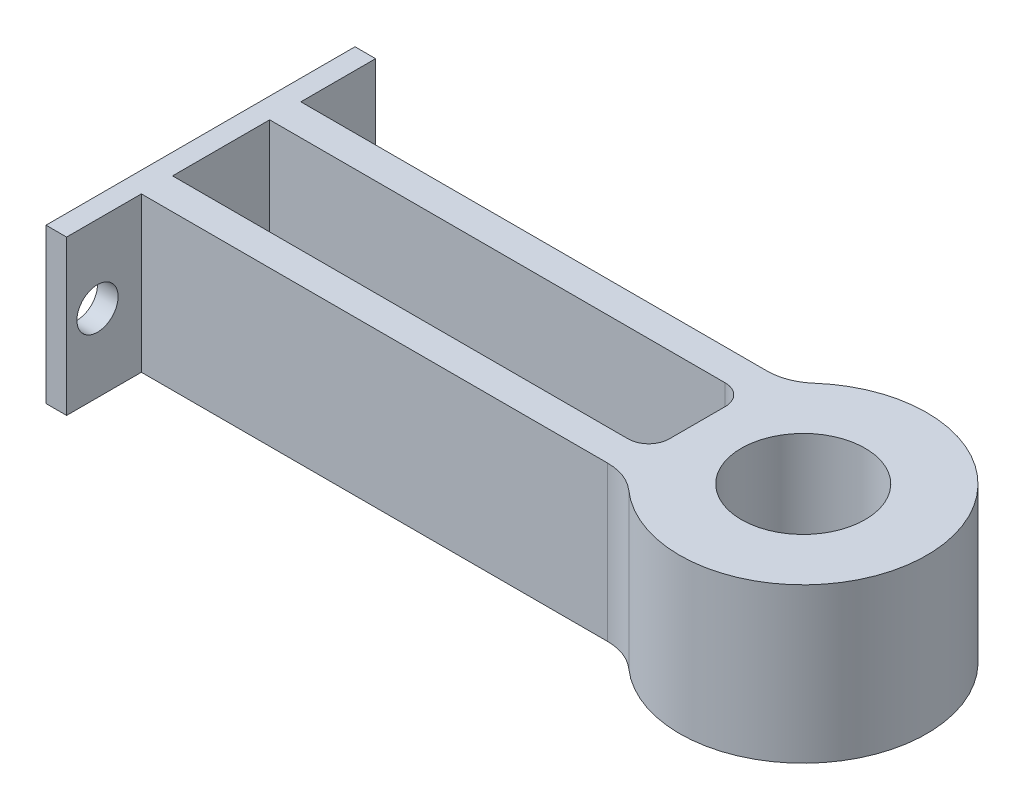
ISO-10303-21;
HEADER;
FILE_DESCRIPTION(('STEP AP214'),'2;1');
FILE_NAME('part.step','',(''),(''),'','','');
FILE_SCHEMA(('AUTOMOTIVE_DESIGN { 1 0 10303 214 1 1 1 1 }'));
ENDSEC;
DATA;
#1=APPLICATION_CONTEXT('core data for automotive mechanical design processes');
#2=APPLICATION_PROTOCOL_DEFINITION('international standard','automotive_design',2000,#1);
#3=PRODUCT_CONTEXT('',#1,'mechanical');
#4=PRODUCT('Part','Part','',(#3));
#5=PRODUCT_RELATED_PRODUCT_CATEGORY('part','',(#4));
#6=PRODUCT_DEFINITION_FORMATION('','',#4);
#7=PRODUCT_DEFINITION_CONTEXT('part definition',#1,'design');
#8=PRODUCT_DEFINITION('design','',#6,#7);
#9=PRODUCT_DEFINITION_SHAPE('','',#8);
#10=(LENGTH_UNIT() NAMED_UNIT(*) SI_UNIT(.MILLI.,.METRE.));
#11=(NAMED_UNIT(*) PLANE_ANGLE_UNIT() SI_UNIT($,.RADIAN.));
#12=(NAMED_UNIT(*) SI_UNIT($,.STERADIAN.) SOLID_ANGLE_UNIT());
#13=UNCERTAINTY_MEASURE_WITH_UNIT(LENGTH_MEASURE(1.E-05),#10,'distance_accuracy_value','');
#14=(GEOMETRIC_REPRESENTATION_CONTEXT(3) GLOBAL_UNCERTAINTY_ASSIGNED_CONTEXT((#13)) GLOBAL_UNIT_ASSIGNED_CONTEXT((#10,
#11,#12)) REPRESENTATION_CONTEXT('',''));
#15=CARTESIAN_POINT('',(0.,0.,0.));
#16=DIRECTION('',(0.,0.,1.));
#17=DIRECTION('',(1.,0.,0.));
#18=AXIS2_PLACEMENT_3D('',#15,#16,#17);
#19=CARTESIAN_POINT('',(-10.2880610801185,15.,6.17703806138108));
#20=DIRECTION('',(-1.,0.,0.));
#21=DIRECTION('',(0.,0.,1.));
#22=AXIS2_PLACEMENT_3D('',#19,#20,#21);
#23=PLANE('',#22);
#24=DIRECTION('',(0.,0.,-1.));
#25=VECTOR('',#24,1.);
#26=CARTESIAN_POINT('',(-10.2880610801185,15.,6.17703806138108));
#27=LINE('',#26,#25);
#28=CARTESIAN_POINT('',(-10.2880610801185,15.,2.71356191809491));
#29=VERTEX_POINT('',#28);
#30=CARTESIAN_POINT('',(-10.2880610801185,15.,-2.71356191809491));
#31=VERTEX_POINT('',#30);
#32=EDGE_CURVE('E250',#29,#31,#27,.T.);
#33=ORIENTED_EDGE('',*,*,#32,.T.);
#34=DIRECTION('',(0.,1.,0.));
#35=VECTOR('',#34,1.);
#36=CARTESIAN_POINT('',(-10.2880610801185,15.,-2.71356191809491));
#37=LINE('',#36,#35);
#38=CARTESIAN_POINT('',(-10.2880610801185,0.,-2.71356191809491));
#39=VERTEX_POINT('',#38);
#40=EDGE_CURVE('E266',#31,#39,#37,.F.);
#41=ORIENTED_EDGE('',*,*,#40,.T.);
#42=DIRECTION('',(0.,0.,-1.));
#43=VECTOR('',#42,1.);
#44=CARTESIAN_POINT('',(-10.2880610801185,0.,6.17703806138108));
#45=LINE('',#44,#43);
#46=CARTESIAN_POINT('',(-10.2880610801185,0.,2.71356191809491));
#47=VERTEX_POINT('',#46);
#48=EDGE_CURVE('E251',#47,#39,#45,.T.);
#49=ORIENTED_EDGE('',*,*,#48,.F.);
#50=DIRECTION('',(0.,1.,0.));
#51=VECTOR('',#50,1.);
#52=CARTESIAN_POINT('',(-10.2880610801185,15.,2.71356191809491));
#53=LINE('',#52,#51);
#54=EDGE_CURVE('E263',#47,#29,#53,.T.);
#55=ORIENTED_EDGE('',*,*,#54,.T.);
#56=EDGE_LOOP('',(#33,#41,#49,#55));
#57=FACE_BOUND('',#56,.T.);
#58=ADVANCED_FACE('F38',(#57),#23,.T.);
#59=CARTESIAN_POINT('',(0.,15.,0.));
#60=DIRECTION('',(0.,-1.,0.));
#61=DIRECTION('',(0.,0.,-1.));
#62=AXIS2_PLACEMENT_3D('',#59,#60,#61);
#63=CYLINDRICAL_SURFACE('',#62,12.);
#64=CARTESIAN_POINT('',(0.,0.,0.));
#65=DIRECTION('',(0.,1.,0.));
#66=DIRECTION('',(0.,0.,1.));
#67=AXIS2_PLACEMENT_3D('',#64,#65,#66);
#68=CIRCLE('',#67,12.);
#69=CARTESIAN_POINT('',(-7.94566690966707,0.,8.99257345594807));
#70=VERTEX_POINT('',#69);
#71=CARTESIAN_POINT('',(-7.94566690966707,0.,-8.99257345594807));
#72=VERTEX_POINT('',#71);
#73=EDGE_CURVE('E239',#70,#72,#68,.T.);
#74=ORIENTED_EDGE('',*,*,#73,.T.);
#75=DIRECTION('',(0.,-1.,0.));
#76=VECTOR('',#75,1.);
#77=CARTESIAN_POINT('',(-7.94566690966707,15.,-8.99257345594807));
#78=LINE('',#77,#76);
#79=CARTESIAN_POINT('',(-7.94566690966707,15.,-8.99257345594807));
#80=VERTEX_POINT('',#79);
#81=EDGE_CURVE('E284',#72,#80,#78,.F.);
#82=ORIENTED_EDGE('',*,*,#81,.T.);
#83=CARTESIAN_POINT('',(0.,15.,0.));
#84=DIRECTION('',(0.,1.,0.));
#85=DIRECTION('',(0.,0.,1.));
#86=AXIS2_PLACEMENT_3D('',#83,#84,#85);
#87=CIRCLE('',#86,12.);
#88=CARTESIAN_POINT('',(-7.94566690966707,15.,8.99257345594807));
#89=VERTEX_POINT('',#88);
#90=EDGE_CURVE('E247',#89,#80,#87,.T.);
#91=ORIENTED_EDGE('',*,*,#90,.F.);
#92=DIRECTION('',(0.,-1.,0.));
#93=VECTOR('',#92,1.);
#94=CARTESIAN_POINT('',(-7.94566690966707,15.,8.99257345594807));
#95=LINE('',#94,#93);
#96=EDGE_CURVE('E281',#89,#70,#95,.T.);
#97=ORIENTED_EDGE('',*,*,#96,.T.);
#98=EDGE_LOOP('',(#74,#82,#91,#97));
#99=FACE_BOUND('',#98,.T.);
#100=ADVANCED_FACE('F305',(#99),#63,.T.);
#101=CARTESIAN_POINT('',(0.,15.,0.));
#102=DIRECTION('',(0.,1.,0.));
#103=DIRECTION('',(0.,0.,1.));
#104=AXIS2_PLACEMENT_3D('',#101,#102,#103);
#105=PLANE('',#104);
#106=DIRECTION('',(1.,0.,0.));
#107=VECTOR('',#106,1.);
#108=CARTESIAN_POINT('',(-56.5120610801185,15.,4.71356191809491));
#109=LINE('',#108,#107);
#110=CARTESIAN_POINT('',(-56.5120610801185,15.,4.71356191809491));
#111=VERTEX_POINT('',#110);
#112=CARTESIAN_POINT('',(-12.2880610801185,15.,4.71356191809491));
#113=VERTEX_POINT('',#112);
#114=EDGE_CURVE('E227',#111,#113,#109,.T.);
#115=ORIENTED_EDGE('',*,*,#114,.F.);
#116=DIRECTION('',(0.,0.,1.));
#117=VECTOR('',#116,1.);
#118=CARTESIAN_POINT('',(-56.5120610801185,15.,0.));
#119=LINE('',#118,#117);
#120=CARTESIAN_POINT('',(-56.5120610801185,15.,-4.71356191809491));
#121=VERTEX_POINT('',#120);
#122=EDGE_CURVE('E202',#121,#111,#119,.T.);
#123=ORIENTED_EDGE('',*,*,#122,.F.);
#124=DIRECTION('',(1.,0.,0.));
#125=VECTOR('',#124,1.);
#126=CARTESIAN_POINT('',(-56.5120610801185,15.,-4.71356191809491));
#127=LINE('',#126,#125);
#128=CARTESIAN_POINT('',(-12.2880610801185,15.,-4.71356191809491));
#129=VERTEX_POINT('',#128);
#130=EDGE_CURVE('E216',#121,#129,#127,.T.);
#131=ORIENTED_EDGE('',*,*,#130,.T.);
#132=CARTESIAN_POINT('',(-12.2880610801185,15.,-2.71356191809491));
#133=DIRECTION('',(0.,1.,0.));
#134=DIRECTION('',(0.,0.,1.));
#135=AXIS2_PLACEMENT_3D('',#132,#133,#134);
#136=CIRCLE('',#135,2.);
#137=EDGE_CURVE('E270',#129,#31,#136,.F.);
#138=ORIENTED_EDGE('',*,*,#137,.T.);
#139=ORIENTED_EDGE('',*,*,#32,.F.);
#140=CARTESIAN_POINT('',(-12.2880610801185,15.,2.71356191809491));
#141=DIRECTION('',(0.,1.,0.));
#142=DIRECTION('',(0.,0.,1.));
#143=AXIS2_PLACEMENT_3D('',#140,#141,#142);
#144=CIRCLE('',#143,2.);
#145=EDGE_CURVE('E274',#29,#113,#144,.F.);
#146=ORIENTED_EDGE('',*,*,#145,.T.);
#147=EDGE_LOOP('',(#115,#123,#131,#138,#139,#146));
#148=FACE_BOUND('',#147,.T.);
#149=CARTESIAN_POINT('',(0.,15.,0.));
#150=DIRECTION('',(0.,1.,0.));
#151=DIRECTION('',(0.,0.,1.));
#152=AXIS2_PLACEMENT_3D('',#149,#150,#151);
#153=CIRCLE('',#152,6.01);
#154=CARTESIAN_POINT('',(0.,15.,6.01));
#155=VERTEX_POINT('',#154);
#156=EDGE_CURVE('E233',#155,#155,#153,.T.);
#157=ORIENTED_EDGE('',*,*,#156,.F.);
#158=EDGE_LOOP('',(#157));
#159=FACE_BOUND('',#158,.T.);
#160=DIRECTION('',(-1.,0.,0.));
#161=VECTOR('',#160,1.);
#162=CARTESIAN_POINT('',(-5.28806108011852,15.,7.73947906259309));
#163=LINE('',#162,#161);
#164=CARTESIAN_POINT('',(-11.2563614553617,15.,7.73947906259309));
#165=VERTEX_POINT('',#164);
#166=CARTESIAN_POINT('',(-56.5120610801185,15.,7.73947906259309));
#167=VERTEX_POINT('',#166);
#168=EDGE_CURVE('E243',#165,#167,#163,.T.);
#169=ORIENTED_EDGE('',*,*,#168,.F.);
#170=CARTESIAN_POINT('',(-11.2563614553617,15.,12.7394790625931));
#171=DIRECTION('',(0.,1.,0.));
#172=DIRECTION('',(0.,0.,1.));
#173=AXIS2_PLACEMENT_3D('',#170,#171,#172);
#174=CIRCLE('',#173,5.);
#175=EDGE_CURVE('E11',#165,#89,#174,.F.);
#176=ORIENTED_EDGE('',*,*,#175,.T.);
#177=ORIENTED_EDGE('',*,*,#90,.T.);
#178=CARTESIAN_POINT('',(-11.2563614553617,15.,-12.7394790625931));
#179=DIRECTION('',(0.,1.,0.));
#180=DIRECTION('',(0.,0.,1.));
#181=AXIS2_PLACEMENT_3D('',#178,#179,#180);
#182=CIRCLE('',#181,5.);
#183=CARTESIAN_POINT('',(-11.2563614553617,15.,-7.73947906259309));
#184=VERTEX_POINT('',#183);
#185=EDGE_CURVE('E289',#80,#184,#182,.F.);
#186=ORIENTED_EDGE('',*,*,#185,.T.);
#187=DIRECTION('',(-1.,0.,0.));
#188=VECTOR('',#187,1.);
#189=CARTESIAN_POINT('',(-5.28806108011852,15.,-7.73947906259309));
#190=LINE('',#189,#188);
#191=CARTESIAN_POINT('',(-56.5120610801185,15.,-7.73947906259309));
#192=VERTEX_POINT('',#191);
#193=EDGE_CURVE('E240',#184,#192,#190,.T.);
#194=ORIENTED_EDGE('',*,*,#193,.T.);
#195=CARTESIAN_POINT('',(-56.5120610801185,15.,-15.));
#196=VERTEX_POINT('',#195);
#197=EDGE_CURVE('E198',#196,#192,#119,.T.);
#198=ORIENTED_EDGE('',*,*,#197,.F.);
#199=DIRECTION('',(1.,0.,0.));
#200=VECTOR('',#199,1.);
#201=CARTESIAN_POINT('',(-58.5120610801185,15.,-15.));
#202=LINE('',#201,#200);
#203=CARTESIAN_POINT('',(-58.5120610801185,15.,-15.));
#204=VERTEX_POINT('',#203);
#205=EDGE_CURVE('E208',#204,#196,#202,.T.);
#206=ORIENTED_EDGE('',*,*,#205,.F.);
#207=DIRECTION('',(0.,0.,1.));
#208=VECTOR('',#207,1.);
#209=CARTESIAN_POINT('',(-58.5120610801185,15.,0.));
#210=LINE('',#209,#208);
#211=CARTESIAN_POINT('',(-58.5120610801185,15.,15.));
#212=VERTEX_POINT('',#211);
#213=EDGE_CURVE('E171',#204,#212,#210,.T.);
#214=ORIENTED_EDGE('',*,*,#213,.T.);
#215=DIRECTION('',(1.,0.,0.));
#216=VECTOR('',#215,1.);
#217=CARTESIAN_POINT('',(-58.5120610801185,15.,15.));
#218=LINE('',#217,#216);
#219=CARTESIAN_POINT('',(-56.5120610801185,15.,15.));
#220=VERTEX_POINT('',#219);
#221=EDGE_CURVE('E162',#212,#220,#218,.T.);
#222=ORIENTED_EDGE('',*,*,#221,.T.);
#223=EDGE_CURVE('E197',#167,#220,#119,.T.);
#224=ORIENTED_EDGE('',*,*,#223,.F.);
#225=EDGE_LOOP('',(#169,#176,#177,#186,#194,#198,#206,#214,#222,#224));
#226=FACE_BOUND('',#225,.T.);
#227=ADVANCED_FACE('F293',(#148,#159,#226),#105,.T.);
#228=CARTESIAN_POINT('',(0.,0.,0.));
#229=DIRECTION('',(0.,1.,0.));
#230=DIRECTION('',(0.,0.,1.));
#231=AXIS2_PLACEMENT_3D('',#228,#229,#230);
#232=PLANE('',#231);
#233=DIRECTION('',(-1.,0.,0.));
#234=VECTOR('',#233,1.);
#235=CARTESIAN_POINT('',(-5.28806108011852,0.,7.73947906259309));
#236=LINE('',#235,#234);
#237=CARTESIAN_POINT('',(-11.2563614553617,0.,7.73947906259309));
#238=VERTEX_POINT('',#237);
#239=CARTESIAN_POINT('',(-56.5120610801185,0.,7.73947906259309));
#240=VERTEX_POINT('',#239);
#241=EDGE_CURVE('E245',#238,#240,#236,.T.);
#242=ORIENTED_EDGE('',*,*,#241,.T.);
#243=DIRECTION('',(0.,0.,-1.));
#244=VECTOR('',#243,1.);
#245=CARTESIAN_POINT('',(-56.5120610801185,0.,0.));
#246=LINE('',#245,#244);
#247=CARTESIAN_POINT('',(-56.5120610801185,0.,15.));
#248=VERTEX_POINT('',#247);
#249=EDGE_CURVE('E157',#248,#240,#246,.T.);
#250=ORIENTED_EDGE('',*,*,#249,.F.);
#251=DIRECTION('',(1.,0.,0.));
#252=VECTOR('',#251,1.);
#253=CARTESIAN_POINT('',(-58.5120610801185,0.,15.));
#254=LINE('',#253,#252);
#255=CARTESIAN_POINT('',(-58.5120610801185,0.,15.));
#256=VERTEX_POINT('',#255);
#257=EDGE_CURVE('E148',#256,#248,#254,.T.);
#258=ORIENTED_EDGE('',*,*,#257,.F.);
#259=DIRECTION('',(0.,0.,-1.));
#260=VECTOR('',#259,1.);
#261=CARTESIAN_POINT('',(-58.5120610801185,0.,0.));
#262=LINE('',#261,#260);
#263=CARTESIAN_POINT('',(-58.5120610801185,0.,-15.));
#264=VERTEX_POINT('',#263);
#265=EDGE_CURVE('E154',#256,#264,#262,.T.);
#266=ORIENTED_EDGE('',*,*,#265,.T.);
#267=DIRECTION('',(1.,0.,0.));
#268=VECTOR('',#267,1.);
#269=CARTESIAN_POINT('',(-58.5120610801185,0.,-15.));
#270=LINE('',#269,#268);
#271=CARTESIAN_POINT('',(-56.5120610801185,0.,-15.));
#272=VERTEX_POINT('',#271);
#273=EDGE_CURVE('E191',#264,#272,#270,.T.);
#274=ORIENTED_EDGE('',*,*,#273,.T.);
#275=CARTESIAN_POINT('',(-56.5120610801185,0.,-7.73947906259309));
#276=VERTEX_POINT('',#275);
#277=EDGE_CURVE('E195',#276,#272,#246,.T.);
#278=ORIENTED_EDGE('',*,*,#277,.F.);
#279=DIRECTION('',(-1.,0.,0.));
#280=VECTOR('',#279,1.);
#281=CARTESIAN_POINT('',(-5.28806108011852,0.,-7.73947906259309));
#282=LINE('',#281,#280);
#283=CARTESIAN_POINT('',(-11.2563614553617,0.,-7.73947906259309));
#284=VERTEX_POINT('',#283);
#285=EDGE_CURVE('E237',#284,#276,#282,.T.);
#286=ORIENTED_EDGE('',*,*,#285,.F.);
#287=CARTESIAN_POINT('',(-11.2563614553617,0.,-12.7394790625931));
#288=DIRECTION('',(0.,1.,0.));
#289=DIRECTION('',(0.,0.,1.));
#290=AXIS2_PLACEMENT_3D('',#287,#288,#289);
#291=CIRCLE('',#290,5.);
#292=EDGE_CURVE('E287',#284,#72,#291,.T.);
#293=ORIENTED_EDGE('',*,*,#292,.T.);
#294=ORIENTED_EDGE('',*,*,#73,.F.);
#295=CARTESIAN_POINT('',(-11.2563614553617,0.,12.7394790625931));
#296=DIRECTION('',(0.,1.,0.));
#297=DIRECTION('',(0.,0.,1.));
#298=AXIS2_PLACEMENT_3D('',#295,#296,#297);
#299=CIRCLE('',#298,5.);
#300=EDGE_CURVE('E46',#70,#238,#299,.T.);
#301=ORIENTED_EDGE('',*,*,#300,.T.);
#302=EDGE_LOOP('',(#242,#250,#258,#266,#274,#278,#286,#293,#294,#301));
#303=FACE_BOUND('',#302,.T.);
#304=CARTESIAN_POINT('',(0.,0.,0.));
#305=DIRECTION('',(0.,1.,0.));
#306=DIRECTION('',(0.,0.,1.));
#307=AXIS2_PLACEMENT_3D('',#304,#305,#306);
#308=CIRCLE('',#307,6.01);
#309=CARTESIAN_POINT('',(0.,0.,6.01));
#310=VERTEX_POINT('',#309);
#311=EDGE_CURVE('E236',#310,#310,#308,.T.);
#312=ORIENTED_EDGE('',*,*,#311,.T.);
#313=EDGE_LOOP('',(#312));
#314=FACE_BOUND('',#313,.T.);
#315=CARTESIAN_POINT('',(-56.5120610801185,0.,4.71356191809491));
#316=VERTEX_POINT('',#315);
#317=CARTESIAN_POINT('',(-56.5120610801185,0.,-4.71356191809491));
#318=VERTEX_POINT('',#317);
#319=EDGE_CURVE('E194',#316,#318,#246,.T.);
#320=ORIENTED_EDGE('',*,*,#319,.F.);
#321=DIRECTION('',(1.,0.,0.));
#322=VECTOR('',#321,1.);
#323=CARTESIAN_POINT('',(-56.5120610801185,0.,4.71356191809491));
#324=LINE('',#323,#322);
#325=CARTESIAN_POINT('',(-12.2880610801185,0.,4.71356191809491));
#326=VERTEX_POINT('',#325);
#327=EDGE_CURVE('E230',#316,#326,#324,.T.);
#328=ORIENTED_EDGE('',*,*,#327,.T.);
#329=CARTESIAN_POINT('',(-12.2880610801185,0.,2.71356191809491));
#330=DIRECTION('',(0.,1.,0.));
#331=DIRECTION('',(0.,0.,1.));
#332=AXIS2_PLACEMENT_3D('',#329,#330,#331);
#333=CIRCLE('',#332,2.);
#334=EDGE_CURVE('E276',#326,#47,#333,.T.);
#335=ORIENTED_EDGE('',*,*,#334,.T.);
#336=ORIENTED_EDGE('',*,*,#48,.T.);
#337=CARTESIAN_POINT('',(-12.2880610801185,0.,-2.71356191809491));
#338=DIRECTION('',(0.,1.,0.));
#339=DIRECTION('',(0.,0.,1.));
#340=AXIS2_PLACEMENT_3D('',#337,#338,#339);
#341=CIRCLE('',#340,2.);
#342=CARTESIAN_POINT('',(-12.2880610801185,0.,-4.71356191809491));
#343=VERTEX_POINT('',#342);
#344=EDGE_CURVE('E272',#39,#343,#341,.T.);
#345=ORIENTED_EDGE('',*,*,#344,.T.);
#346=DIRECTION('',(1.,0.,0.));
#347=VECTOR('',#346,1.);
#348=CARTESIAN_POINT('',(-56.5120610801185,0.,-4.71356191809491));
#349=LINE('',#348,#347);
#350=EDGE_CURVE('E219',#318,#343,#349,.T.);
#351=ORIENTED_EDGE('',*,*,#350,.F.);
#352=EDGE_LOOP('',(#320,#328,#335,#336,#345,#351));
#353=FACE_BOUND('',#352,.T.);
#354=ADVANCED_FACE('F150',(#303,#314,#353),#232,.F.);
#355=CARTESIAN_POINT('',(-5.28806108011852,0.,7.73947906259309));
#356=DIRECTION('',(0.,0.,1.));
#357=DIRECTION('',(0.,-1.,0.));
#358=AXIS2_PLACEMENT_3D('',#355,#356,#357);
#359=PLANE('',#358);
#360=ORIENTED_EDGE('',*,*,#241,.F.);
#361=DIRECTION('',(0.,-1.,0.));
#362=VECTOR('',#361,1.);
#363=CARTESIAN_POINT('',(-11.2563614553617,0.,7.73947906259309));
#364=LINE('',#363,#362);
#365=EDGE_CURVE('E59',#238,#165,#364,.F.);
#366=ORIENTED_EDGE('',*,*,#365,.T.);
#367=ORIENTED_EDGE('',*,*,#168,.T.);
#368=DIRECTION('',(0.,1.,0.));
#369=VECTOR('',#368,1.);
#370=CARTESIAN_POINT('',(-56.5120610801185,0.,7.73947906259309));
#371=LINE('',#370,#369);
#372=EDGE_CURVE('E224',#240,#167,#371,.T.);
#373=ORIENTED_EDGE('',*,*,#372,.F.);
#374=EDGE_LOOP('',(#360,#366,#367,#373));
#375=FACE_BOUND('',#374,.T.);
#376=ADVANCED_FACE('F311',(#375),#359,.T.);
#377=CARTESIAN_POINT('',(-5.28806108011852,0.,-7.73947906259309));
#378=DIRECTION('',(0.,0.,1.));
#379=DIRECTION('',(1.,0.,0.));
#380=AXIS2_PLACEMENT_3D('',#377,#378,#379);
#381=PLANE('',#380);
#382=ORIENTED_EDGE('',*,*,#193,.F.);
#383=DIRECTION('',(0.,1.,0.));
#384=VECTOR('',#383,1.);
#385=CARTESIAN_POINT('',(-11.2563614553617,0.,-7.73947906259309));
#386=LINE('',#385,#384);
#387=EDGE_CURVE('E278',#184,#284,#386,.F.);
#388=ORIENTED_EDGE('',*,*,#387,.T.);
#389=ORIENTED_EDGE('',*,*,#285,.T.);
#390=DIRECTION('',(0.,-1.,0.));
#391=VECTOR('',#390,1.);
#392=CARTESIAN_POINT('',(-56.5120610801185,0.,-7.73947906259309));
#393=LINE('',#392,#391);
#394=EDGE_CURVE('E213',#192,#276,#393,.T.);
#395=ORIENTED_EDGE('',*,*,#394,.F.);
#396=EDGE_LOOP('',(#382,#388,#389,#395));
#397=FACE_BOUND('',#396,.T.);
#398=ADVANCED_FACE('F300',(#397),#381,.F.);
#399=CARTESIAN_POINT('',(0.,-185.,0.));
#400=DIRECTION('',(0.,1.,0.));
#401=DIRECTION('',(0.,0.,1.));
#402=AXIS2_PLACEMENT_3D('',#399,#400,#401);
#403=CYLINDRICAL_SURFACE('',#402,6.01);
#404=ORIENTED_EDGE('',*,*,#156,.T.);
#405=EDGE_LOOP('',(#404));
#406=FACE_BOUND('',#405,.T.);
#407=ORIENTED_EDGE('',*,*,#311,.F.);
#408=EDGE_LOOP('',(#407));
#409=FACE_BOUND('',#408,.T.);
#410=ADVANCED_FACE('F349',(#406,#409),#403,.F.);
#411=CARTESIAN_POINT('',(-56.5120610801185,0.,4.71356191809491));
#412=DIRECTION('',(0.,0.,-1.));
#413=DIRECTION('',(0.,1.,0.));
#414=AXIS2_PLACEMENT_3D('',#411,#412,#413);
#415=PLANE('',#414);
#416=ORIENTED_EDGE('',*,*,#114,.T.);
#417=DIRECTION('',(0.,1.,0.));
#418=VECTOR('',#417,1.);
#419=CARTESIAN_POINT('',(-12.2880610801185,0.,4.71356191809491));
#420=LINE('',#419,#418);
#421=EDGE_CURVE('E268',#113,#326,#420,.F.);
#422=ORIENTED_EDGE('',*,*,#421,.T.);
#423=ORIENTED_EDGE('',*,*,#327,.F.);
#424=DIRECTION('',(0.,1.,0.));
#425=VECTOR('',#424,1.);
#426=CARTESIAN_POINT('',(-56.5120610801185,0.,4.71356191809491));
#427=LINE('',#426,#425);
#428=EDGE_CURVE('E222',#316,#111,#427,.T.);
#429=ORIENTED_EDGE('',*,*,#428,.T.);
#430=EDGE_LOOP('',(#416,#422,#423,#429));
#431=FACE_BOUND('',#430,.T.);
#432=ADVANCED_FACE('F347',(#431),#415,.T.);
#433=CARTESIAN_POINT('',(-56.5120610801185,0.,-4.71356191809491));
#434=DIRECTION('',(0.,0.,-1.));
#435=DIRECTION('',(0.,1.,0.));
#436=AXIS2_PLACEMENT_3D('',#433,#434,#435);
#437=PLANE('',#436);
#438=ORIENTED_EDGE('',*,*,#350,.T.);
#439=DIRECTION('',(0.,1.,0.));
#440=VECTOR('',#439,1.);
#441=CARTESIAN_POINT('',(-12.2880610801185,0.,-4.71356191809491));
#442=LINE('',#441,#440);
#443=EDGE_CURVE('E254',#343,#129,#442,.T.);
#444=ORIENTED_EDGE('',*,*,#443,.T.);
#445=ORIENTED_EDGE('',*,*,#130,.F.);
#446=DIRECTION('',(0.,1.,0.));
#447=VECTOR('',#446,1.);
#448=CARTESIAN_POINT('',(-56.5120610801185,0.,-4.71356191809491));
#449=LINE('',#448,#447);
#450=EDGE_CURVE('E161',#318,#121,#449,.T.);
#451=ORIENTED_EDGE('',*,*,#450,.F.);
#452=EDGE_LOOP('',(#438,#444,#445,#451));
#453=FACE_BOUND('',#452,.T.);
#454=ADVANCED_FACE('F332',(#453),#437,.F.);
#455=CARTESIAN_POINT('',(-12.2880610801185,0.,-2.71356191809491));
#456=DIRECTION('',(0.,1.,0.));
#457=DIRECTION('',(0.,0.,1.));
#458=AXIS2_PLACEMENT_3D('',#455,#456,#457);
#459=CYLINDRICAL_SURFACE('',#458,2.);
#460=ORIENTED_EDGE('',*,*,#344,.F.);
#461=ORIENTED_EDGE('',*,*,#40,.F.);
#462=ORIENTED_EDGE('',*,*,#137,.F.);
#463=ORIENTED_EDGE('',*,*,#443,.F.);
#464=EDGE_LOOP('',(#460,#461,#462,#463));
#465=FACE_BOUND('',#464,.T.);
#466=ADVANCED_FACE('F334',(#465),#459,.F.);
#467=CARTESIAN_POINT('',(-12.2880610801185,15.,2.71356191809491));
#468=DIRECTION('',(0.,-1.,0.));
#469=DIRECTION('',(0.,0.,-1.));
#470=AXIS2_PLACEMENT_3D('',#467,#468,#469);
#471=CYLINDRICAL_SURFACE('',#470,2.);
#472=ORIENTED_EDGE('',*,*,#334,.F.);
#473=ORIENTED_EDGE('',*,*,#421,.F.);
#474=ORIENTED_EDGE('',*,*,#145,.F.);
#475=ORIENTED_EDGE('',*,*,#54,.F.);
#476=EDGE_LOOP('',(#472,#473,#474,#475));
#477=FACE_BOUND('',#476,.T.);
#478=ADVANCED_FACE('F344',(#477),#471,.F.);
#479=CARTESIAN_POINT('',(-11.2563614553617,15.,-12.7394790625931));
#480=DIRECTION('',(0.,-1.,0.));
#481=DIRECTION('',(0.,0.,-1.));
#482=AXIS2_PLACEMENT_3D('',#479,#480,#481);
#483=CYLINDRICAL_SURFACE('',#482,5.);
#484=ORIENTED_EDGE('',*,*,#185,.F.);
#485=ORIENTED_EDGE('',*,*,#81,.F.);
#486=ORIENTED_EDGE('',*,*,#292,.F.);
#487=ORIENTED_EDGE('',*,*,#387,.F.);
#488=EDGE_LOOP('',(#484,#485,#486,#487));
#489=FACE_BOUND('',#488,.T.);
#490=ADVANCED_FACE('F302',(#489),#483,.F.);
#491=CARTESIAN_POINT('',(-11.2563614553617,15.,12.7394790625931));
#492=DIRECTION('',(0.,-1.,0.));
#493=DIRECTION('',(0.,0.,-1.));
#494=AXIS2_PLACEMENT_3D('',#491,#492,#493);
#495=CYLINDRICAL_SURFACE('',#494,5.);
#496=ORIENTED_EDGE('',*,*,#175,.F.);
#497=ORIENTED_EDGE('',*,*,#365,.F.);
#498=ORIENTED_EDGE('',*,*,#300,.F.);
#499=ORIENTED_EDGE('',*,*,#96,.F.);
#500=EDGE_LOOP('',(#496,#497,#498,#499));
#501=FACE_BOUND('',#500,.T.);
#502=ADVANCED_FACE('F40',(#501),#495,.F.);
#503=CARTESIAN_POINT('',(-56.5120610801185,0.,0.));
#504=DIRECTION('',(-1.,0.,0.));
#505=DIRECTION('',(0.,0.,1.));
#506=AXIS2_PLACEMENT_3D('',#503,#504,#505);
#507=PLANE('',#506);
#508=CARTESIAN_POINT('',(-56.5120610801185,7.5,-12.));
#509=DIRECTION('',(-1.,0.,0.));
#510=DIRECTION('',(0.,0.,1.));
#511=AXIS2_PLACEMENT_3D('',#508,#509,#510);
#512=CIRCLE('',#511,2.);
#513=CARTESIAN_POINT('',(-56.5120610801185,7.5,-10.));
#514=VERTEX_POINT('',#513);
#515=EDGE_CURVE('E177',#514,#514,#512,.T.);
#516=ORIENTED_EDGE('',*,*,#515,.T.);
#517=EDGE_LOOP('',(#516));
#518=FACE_BOUND('',#517,.T.);
#519=ORIENTED_EDGE('',*,*,#197,.T.);
#520=ORIENTED_EDGE('',*,*,#394,.T.);
#521=ORIENTED_EDGE('',*,*,#277,.T.);
#522=DIRECTION('',(0.,1.,0.));
#523=VECTOR('',#522,1.);
#524=CARTESIAN_POINT('',(-56.5120610801185,0.,-15.));
#525=LINE('',#524,#523);
#526=EDGE_CURVE('E201',#272,#196,#525,.T.);
#527=ORIENTED_EDGE('',*,*,#526,.T.);
#528=EDGE_LOOP('',(#519,#520,#521,#527));
#529=FACE_BOUND('',#528,.T.);
#530=ADVANCED_FACE('F374',(#518,#529),#507,.F.);
#531=ORIENTED_EDGE('',*,*,#372,.T.);
#532=ORIENTED_EDGE('',*,*,#223,.T.);
#533=DIRECTION('',(0.,1.,0.));
#534=VECTOR('',#533,1.);
#535=CARTESIAN_POINT('',(-56.5120610801185,0.,15.));
#536=LINE('',#535,#534);
#537=EDGE_CURVE('E193',#248,#220,#536,.T.);
#538=ORIENTED_EDGE('',*,*,#537,.F.);
#539=ORIENTED_EDGE('',*,*,#249,.T.);
#540=EDGE_LOOP('',(#531,#532,#538,#539));
#541=FACE_BOUND('',#540,.T.);
#542=CARTESIAN_POINT('',(-56.5120610801185,7.5,12.));
#543=DIRECTION('',(-1.,0.,0.));
#544=DIRECTION('',(0.,0.,1.));
#545=AXIS2_PLACEMENT_3D('',#542,#543,#544);
#546=CIRCLE('',#545,2.);
#547=CARTESIAN_POINT('',(-56.5120610801185,7.5,14.));
#548=VERTEX_POINT('',#547);
#549=EDGE_CURVE('E180',#548,#548,#546,.F.);
#550=ORIENTED_EDGE('',*,*,#549,.F.);
#551=EDGE_LOOP('',(#550));
#552=FACE_BOUND('',#551,.T.);
#553=ADVANCED_FACE('F313',(#541,#552),#507,.F.);
#554=ORIENTED_EDGE('',*,*,#428,.F.);
#555=ORIENTED_EDGE('',*,*,#319,.T.);
#556=ORIENTED_EDGE('',*,*,#450,.T.);
#557=ORIENTED_EDGE('',*,*,#122,.T.);
#558=EDGE_LOOP('',(#554,#555,#556,#557));
#559=FACE_BOUND('',#558,.T.);
#560=ADVANCED_FACE('F323',(#559),#507,.F.);
#561=CARTESIAN_POINT('',(-58.5120610801185,0.,15.));
#562=DIRECTION('',(0.,0.,-1.));
#563=DIRECTION('',(-1.,0.,0.));
#564=AXIS2_PLACEMENT_3D('',#561,#562,#563);
#565=PLANE('',#564);
#566=ORIENTED_EDGE('',*,*,#537,.T.);
#567=ORIENTED_EDGE('',*,*,#221,.F.);
#568=DIRECTION('',(0.,1.,0.));
#569=VECTOR('',#568,1.);
#570=CARTESIAN_POINT('',(-58.5120610801185,0.,15.));
#571=LINE('',#570,#569);
#572=EDGE_CURVE('E165',#256,#212,#571,.T.);
#573=ORIENTED_EDGE('',*,*,#572,.F.);
#574=ORIENTED_EDGE('',*,*,#257,.T.);
#575=EDGE_LOOP('',(#566,#567,#573,#574));
#576=FACE_BOUND('',#575,.T.);
#577=ADVANCED_FACE('F166',(#576),#565,.F.);
#578=CARTESIAN_POINT('',(-58.5120610801185,7.5,12.));
#579=DIRECTION('',(1.,0.,0.));
#580=DIRECTION('',(0.,0.,-1.));
#581=AXIS2_PLACEMENT_3D('',#578,#579,#580);
#582=CYLINDRICAL_SURFACE('',#581,2.);
#583=CARTESIAN_POINT('',(-58.5120610801185,7.5,12.));
#584=DIRECTION('',(-1.,0.,0.));
#585=DIRECTION('',(0.,0.,1.));
#586=AXIS2_PLACEMENT_3D('',#583,#584,#585);
#587=CIRCLE('',#586,2.);
#588=CARTESIAN_POINT('',(-58.5120610801185,7.5,14.));
#589=VERTEX_POINT('',#588);
#590=EDGE_CURVE('E185',#589,#589,#587,.F.);
#591=ORIENTED_EDGE('',*,*,#590,.F.);
#592=EDGE_LOOP('',(#591));
#593=FACE_BOUND('',#592,.T.);
#594=ORIENTED_EDGE('',*,*,#549,.T.);
#595=EDGE_LOOP('',(#594));
#596=FACE_BOUND('',#595,.T.);
#597=ADVANCED_FACE('F389',(#593,#596),#582,.F.);
#598=CARTESIAN_POINT('',(-58.5120610801185,0.,-15.));
#599=DIRECTION('',(0.,0.,-1.));
#600=DIRECTION('',(-1.,0.,0.));
#601=AXIS2_PLACEMENT_3D('',#598,#599,#600);
#602=PLANE('',#601);
#603=ORIENTED_EDGE('',*,*,#526,.F.);
#604=ORIENTED_EDGE('',*,*,#273,.F.);
#605=DIRECTION('',(0.,1.,0.));
#606=VECTOR('',#605,1.);
#607=CARTESIAN_POINT('',(-58.5120610801185,0.,-15.));
#608=LINE('',#607,#606);
#609=EDGE_CURVE('E176',#264,#204,#608,.T.);
#610=ORIENTED_EDGE('',*,*,#609,.T.);
#611=ORIENTED_EDGE('',*,*,#205,.T.);
#612=EDGE_LOOP('',(#603,#604,#610,#611));
#613=FACE_BOUND('',#612,.T.);
#614=ADVANCED_FACE('F317',(#613),#602,.T.);
#615=CARTESIAN_POINT('',(-58.5120610801185,7.5,-12.));
#616=DIRECTION('',(1.,0.,0.));
#617=DIRECTION('',(0.,0.,-1.));
#618=AXIS2_PLACEMENT_3D('',#615,#616,#617);
#619=CYLINDRICAL_SURFACE('',#618,2.);
#620=CARTESIAN_POINT('',(-58.5120610801185,7.5,-12.));
#621=DIRECTION('',(-1.,0.,0.));
#622=DIRECTION('',(0.,0.,1.));
#623=AXIS2_PLACEMENT_3D('',#620,#621,#622);
#624=CIRCLE('',#623,2.);
#625=CARTESIAN_POINT('',(-58.5120610801185,7.5,-10.));
#626=VERTEX_POINT('',#625);
#627=EDGE_CURVE('E188',#626,#626,#624,.T.);
#628=ORIENTED_EDGE('',*,*,#627,.T.);
#629=EDGE_LOOP('',(#628));
#630=FACE_BOUND('',#629,.T.);
#631=ORIENTED_EDGE('',*,*,#515,.F.);
#632=EDGE_LOOP('',(#631));
#633=FACE_BOUND('',#632,.T.);
#634=ADVANCED_FACE('F398',(#630,#633),#619,.F.);
#635=CARTESIAN_POINT('',(-58.5120610801185,0.,0.));
#636=DIRECTION('',(-1.,0.,0.));
#637=DIRECTION('',(0.,0.,1.));
#638=AXIS2_PLACEMENT_3D('',#635,#636,#637);
#639=PLANE('',#638);
#640=ORIENTED_EDGE('',*,*,#265,.F.);
#641=ORIENTED_EDGE('',*,*,#572,.T.);
#642=ORIENTED_EDGE('',*,*,#213,.F.);
#643=ORIENTED_EDGE('',*,*,#609,.F.);
#644=EDGE_LOOP('',(#640,#641,#642,#643));
#645=FACE_BOUND('',#644,.T.);
#646=ORIENTED_EDGE('',*,*,#590,.T.);
#647=EDGE_LOOP('',(#646));
#648=FACE_BOUND('',#647,.T.);
#649=ORIENTED_EDGE('',*,*,#627,.F.);
#650=EDGE_LOOP('',(#649));
#651=FACE_BOUND('',#650,.T.);
#652=ADVANCED_FACE('F173',(#645,#648,#651),#639,.T.);
#653=CLOSED_SHELL('',(#58,#100,#227,#354,#376,#398,#410,#432,#454,#466,#478,#490,#502,#530,#553,
#560,#577,#597,#614,#634,#652));
#654=MANIFOLD_SOLID_BREP('B2',#653);
#655=ADVANCED_BREP_SHAPE_REPRESENTATION('',(#18,#654),#14);
#656=SHAPE_DEFINITION_REPRESENTATION(#9,#655);
ENDSEC;
END-ISO-10303-21;
